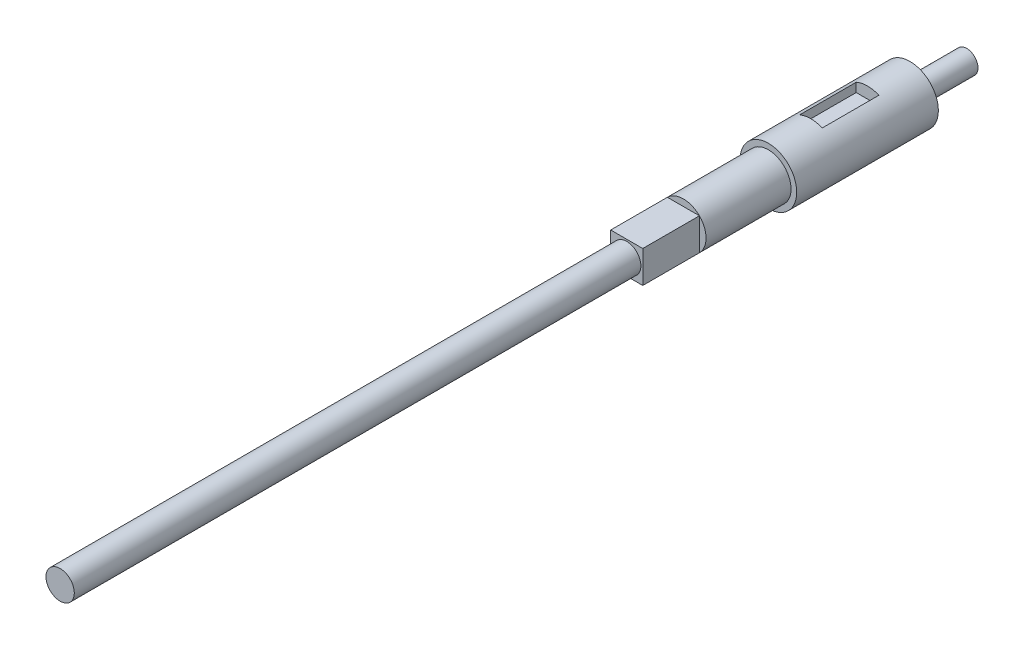
ISO-10303-21;
HEADER;
FILE_DESCRIPTION(('STEP AP214'),'2;1');
FILE_NAME('part.step','',(''),(''),'','','');
FILE_SCHEMA(('AUTOMOTIVE_DESIGN { 1 0 10303 214 1 1 1 1 }'));
ENDSEC;
DATA;
#1=APPLICATION_CONTEXT('core data for automotive mechanical design processes');
#2=APPLICATION_PROTOCOL_DEFINITION('international standard','automotive_design',2000,#1);
#3=PRODUCT_CONTEXT('',#1,'mechanical');
#4=PRODUCT('Part','Part','',(#3));
#5=PRODUCT_RELATED_PRODUCT_CATEGORY('part','',(#4));
#6=PRODUCT_DEFINITION_FORMATION('','',#4);
#7=PRODUCT_DEFINITION_CONTEXT('part definition',#1,'design');
#8=PRODUCT_DEFINITION('design','',#6,#7);
#9=PRODUCT_DEFINITION_SHAPE('','',#8);
#10=(LENGTH_UNIT() NAMED_UNIT(*) SI_UNIT(.MILLI.,.METRE.));
#11=(NAMED_UNIT(*) PLANE_ANGLE_UNIT() SI_UNIT($,.RADIAN.));
#12=(NAMED_UNIT(*) SI_UNIT($,.STERADIAN.) SOLID_ANGLE_UNIT());
#13=UNCERTAINTY_MEASURE_WITH_UNIT(LENGTH_MEASURE(1.E-05),#10,'distance_accuracy_value','');
#14=(GEOMETRIC_REPRESENTATION_CONTEXT(3) GLOBAL_UNCERTAINTY_ASSIGNED_CONTEXT((#13)) GLOBAL_UNIT_ASSIGNED_CONTEXT((#10,
#11,#12)) REPRESENTATION_CONTEXT('',''));
#15=CARTESIAN_POINT('',(0.,0.,0.));
#16=DIRECTION('',(0.,0.,1.));
#17=DIRECTION('',(1.,0.,0.));
#18=AXIS2_PLACEMENT_3D('',#15,#16,#17);
#19=CARTESIAN_POINT('',(0.,0.,27.5));
#20=DIRECTION('',(0.,0.,1.));
#21=DIRECTION('',(1.,0.,0.));
#22=AXIS2_PLACEMENT_3D('',#19,#20,#21);
#23=PLANE('',#22);
#24=DIRECTION('',(0.,1.,0.));
#25=VECTOR('',#24,1.);
#26=CARTESIAN_POINT('',(2.82842712474619,-2.82842712474619,27.5));
#27=LINE('',#26,#25);
#28=CARTESIAN_POINT('',(2.82842712474619,-2.82842712474619,27.5));
#29=VERTEX_POINT('',#28);
#30=CARTESIAN_POINT('',(2.82842712474619,2.82842712474619,27.5));
#31=VERTEX_POINT('',#30);
#32=EDGE_CURVE('E60',#29,#31,#27,.T.);
#33=ORIENTED_EDGE('',*,*,#32,.F.);
#34=CARTESIAN_POINT('',(0.,0.,27.5));
#35=DIRECTION('',(0.,0.,1.));
#36=DIRECTION('',(1.,0.,0.));
#37=AXIS2_PLACEMENT_3D('',#34,#35,#36);
#38=CIRCLE('',#37,4.);
#39=EDGE_CURVE('E169',#29,#31,#38,.T.);
#40=ORIENTED_EDGE('',*,*,#39,.T.);
#41=EDGE_LOOP('',(#33,#40));
#42=FACE_BOUND('',#41,.T.);
#43=ADVANCED_FACE('F37',(#42),#23,.T.);
#44=DIRECTION('',(1.,0.,0.));
#45=VECTOR('',#44,1.);
#46=CARTESIAN_POINT('',(-2.82842712474619,-2.82842712474619,27.5));
#47=LINE('',#46,#45);
#48=CARTESIAN_POINT('',(-2.82842712474619,-2.82842712474619,27.5));
#49=VERTEX_POINT('',#48);
#50=EDGE_CURVE('E142',#49,#29,#47,.T.);
#51=ORIENTED_EDGE('',*,*,#50,.F.);
#52=EDGE_CURVE('E256',#49,#29,#38,.T.);
#53=ORIENTED_EDGE('',*,*,#52,.T.);
#54=EDGE_LOOP('',(#51,#53));
#55=FACE_BOUND('',#54,.T.);
#56=ADVANCED_FACE('F210',(#55),#23,.T.);
#57=DIRECTION('',(0.,-1.,0.));
#58=VECTOR('',#57,1.);
#59=CARTESIAN_POINT('',(-2.82842712474619,-2.82842712474619,27.5));
#60=LINE('',#59,#58);
#61=CARTESIAN_POINT('',(-2.82842712474619,2.82842712474619,27.5));
#62=VERTEX_POINT('',#61);
#63=EDGE_CURVE('E153',#62,#49,#60,.T.);
#64=ORIENTED_EDGE('',*,*,#63,.F.);
#65=EDGE_CURVE('E173',#62,#49,#38,.T.);
#66=ORIENTED_EDGE('',*,*,#65,.T.);
#67=EDGE_LOOP('',(#64,#66));
#68=FACE_BOUND('',#67,.T.);
#69=ADVANCED_FACE('F216',(#68),#23,.T.);
#70=CARTESIAN_POINT('',(0.,0.,12.5));
#71=DIRECTION('',(0.,0.,-1.));
#72=DIRECTION('',(-1.,0.,0.));
#73=AXIS2_PLACEMENT_3D('',#70,#71,#72);
#74=CYLINDRICAL_SURFACE('',#73,5.);
#75=DIRECTION('',(0.,0.,-1.));
#76=VECTOR('',#75,1.);
#77=CARTESIAN_POINT('',(-2.,4.58257569495584,12.5));
#78=LINE('',#77,#76);
#79=CARTESIAN_POINT('',(-2.,4.58257569495584,5.));
#80=VERTEX_POINT('',#79);
#81=CARTESIAN_POINT('',(-2.,4.58257569495584,-5.));
#82=VERTEX_POINT('',#81);
#83=EDGE_CURVE('E41',#80,#82,#78,.T.);
#84=ORIENTED_EDGE('',*,*,#83,.T.);
#85=CARTESIAN_POINT('',(0.,0.,-5.));
#86=DIRECTION('',(0.,0.,-1.));
#87=DIRECTION('',(-1.,0.,0.));
#88=AXIS2_PLACEMENT_3D('',#85,#86,#87);
#89=CIRCLE('',#88,5.);
#90=CARTESIAN_POINT('',(2.,4.58257569495584,-5.));
#91=VERTEX_POINT('',#90);
#92=EDGE_CURVE('E177',#82,#91,#89,.T.);
#93=ORIENTED_EDGE('',*,*,#92,.T.);
#94=DIRECTION('',(0.,0.,-1.));
#95=VECTOR('',#94,1.);
#96=CARTESIAN_POINT('',(2.,4.58257569495584,12.5));
#97=LINE('',#96,#95);
#98=CARTESIAN_POINT('',(2.,4.58257569495584,5.));
#99=VERTEX_POINT('',#98);
#100=EDGE_CURVE('E109',#91,#99,#97,.F.);
#101=ORIENTED_EDGE('',*,*,#100,.T.);
#102=CARTESIAN_POINT('',(0.,0.,5.));
#103=DIRECTION('',(0.,0.,1.));
#104=DIRECTION('',(1.,0.,0.));
#105=AXIS2_PLACEMENT_3D('',#102,#103,#104);
#106=CIRCLE('',#105,5.);
#107=EDGE_CURVE('E190',#99,#80,#106,.T.);
#108=ORIENTED_EDGE('',*,*,#107,.T.);
#109=EDGE_LOOP('',(#84,#93,#101,#108));
#110=FACE_BOUND('',#109,.T.);
#111=CARTESIAN_POINT('',(0.,0.,12.5));
#112=DIRECTION('',(0.,0.,1.));
#113=DIRECTION('',(1.,0.,0.));
#114=AXIS2_PLACEMENT_3D('',#111,#112,#113);
#115=CIRCLE('',#114,5.);
#116=CARTESIAN_POINT('',(5.,0.,12.5));
#117=VERTEX_POINT('',#116);
#118=EDGE_CURVE('E184',#117,#117,#115,.T.);
#119=ORIENTED_EDGE('',*,*,#118,.F.);
#120=EDGE_LOOP('',(#119));
#121=FACE_BOUND('',#120,.T.);
#122=CARTESIAN_POINT('',(0.,0.,-12.5));
#123=DIRECTION('',(0.,0.,1.));
#124=DIRECTION('',(1.,0.,0.));
#125=AXIS2_PLACEMENT_3D('',#122,#123,#124);
#126=CIRCLE('',#125,5.);
#127=CARTESIAN_POINT('',(5.,0.,-12.5));
#128=VERTEX_POINT('',#127);
#129=EDGE_CURVE('E181',#128,#128,#126,.T.);
#130=ORIENTED_EDGE('',*,*,#129,.T.);
#131=EDGE_LOOP('',(#130));
#132=FACE_BOUND('',#131,.T.);
#133=ADVANCED_FACE('F39',(#110,#121,#132),#74,.T.);
#134=CARTESIAN_POINT('',(0.,0.,12.5));
#135=DIRECTION('',(0.,0.,1.));
#136=DIRECTION('',(1.,0.,0.));
#137=AXIS2_PLACEMENT_3D('',#134,#135,#136);
#138=PLANE('',#137);
#139=CARTESIAN_POINT('',(0.,0.,12.5));
#140=DIRECTION('',(0.,0.,1.));
#141=DIRECTION('',(1.,0.,0.));
#142=AXIS2_PLACEMENT_3D('',#139,#140,#141);
#143=CIRCLE('',#142,4.);
#144=CARTESIAN_POINT('',(4.,0.,12.5));
#145=VERTEX_POINT('',#144);
#146=EDGE_CURVE('E174',#145,#145,#143,.T.);
#147=ORIENTED_EDGE('',*,*,#146,.F.);
#148=EDGE_LOOP('',(#147));
#149=FACE_BOUND('',#148,.T.);
#150=ORIENTED_EDGE('',*,*,#118,.T.);
#151=EDGE_LOOP('',(#150));
#152=FACE_BOUND('',#151,.T.);
#153=ADVANCED_FACE('F237',(#149,#152),#138,.T.);
#154=CARTESIAN_POINT('',(0.,0.,-12.5));
#155=DIRECTION('',(0.,0.,1.));
#156=DIRECTION('',(1.,0.,0.));
#157=AXIS2_PLACEMENT_3D('',#154,#155,#156);
#158=PLANE('',#157);
#159=CARTESIAN_POINT('',(0.,0.,-12.5));
#160=DIRECTION('',(0.,0.,-1.));
#161=DIRECTION('',(-1.,0.,0.));
#162=AXIS2_PLACEMENT_3D('',#159,#160,#161);
#163=CIRCLE('',#162,2.);
#164=CARTESIAN_POINT('',(-2.,0.,-12.5));
#165=VERTEX_POINT('',#164);
#166=EDGE_CURVE('E178',#165,#165,#163,.T.);
#167=ORIENTED_EDGE('',*,*,#166,.F.);
#168=EDGE_LOOP('',(#167));
#169=FACE_BOUND('',#168,.T.);
#170=ORIENTED_EDGE('',*,*,#129,.F.);
#171=EDGE_LOOP('',(#170));
#172=FACE_BOUND('',#171,.T.);
#173=ADVANCED_FACE('F263',(#169,#172),#158,.F.);
#174=CARTESIAN_POINT('',(0.,0.,-22.5));
#175=DIRECTION('',(0.,0.,1.));
#176=DIRECTION('',(1.,0.,0.));
#177=AXIS2_PLACEMENT_3D('',#174,#175,#176);
#178=CYLINDRICAL_SURFACE('',#177,2.);
#179=CARTESIAN_POINT('',(0.,0.,-22.5));
#180=DIRECTION('',(0.,0.,-1.));
#181=DIRECTION('',(-1.,0.,0.));
#182=AXIS2_PLACEMENT_3D('',#179,#180,#181);
#183=CIRCLE('',#182,2.);
#184=CARTESIAN_POINT('',(-2.,0.,-22.5));
#185=VERTEX_POINT('',#184);
#186=EDGE_CURVE('E172',#185,#185,#183,.T.);
#187=ORIENTED_EDGE('',*,*,#186,.F.);
#188=EDGE_LOOP('',(#187));
#189=FACE_BOUND('',#188,.T.);
#190=ORIENTED_EDGE('',*,*,#166,.T.);
#191=EDGE_LOOP('',(#190));
#192=FACE_BOUND('',#191,.T.);
#193=ADVANCED_FACE('F270',(#189,#192),#178,.T.);
#194=CARTESIAN_POINT('',(0.,0.,-22.5));
#195=DIRECTION('',(0.,0.,-1.));
#196=DIRECTION('',(-1.,0.,0.));
#197=AXIS2_PLACEMENT_3D('',#194,#195,#196);
#198=PLANE('',#197);
#199=ORIENTED_EDGE('',*,*,#186,.T.);
#200=EDGE_LOOP('',(#199));
#201=FACE_BOUND('',#200,.T.);
#202=ADVANCED_FACE('F230',(#201),#198,.T.);
#203=CARTESIAN_POINT('',(0.,0.,27.5));
#204=DIRECTION('',(0.,0.,-1.));
#205=DIRECTION('',(-1.,0.,0.));
#206=AXIS2_PLACEMENT_3D('',#203,#204,#205);
#207=CYLINDRICAL_SURFACE('',#206,4.);
#208=EDGE_CURVE('E170',#31,#62,#38,.T.);
#209=ORIENTED_EDGE('',*,*,#208,.F.);
#210=ORIENTED_EDGE('',*,*,#39,.F.);
#211=ORIENTED_EDGE('',*,*,#52,.F.);
#212=ORIENTED_EDGE('',*,*,#65,.F.);
#213=EDGE_LOOP('',(#209,#210,#211,#212));
#214=FACE_BOUND('',#213,.T.);
#215=ORIENTED_EDGE('',*,*,#146,.T.);
#216=EDGE_LOOP('',(#215));
#217=FACE_BOUND('',#216,.T.);
#218=ADVANCED_FACE('F222',(#214,#217),#207,.T.);
#219=DIRECTION('',(-1.,0.,0.));
#220=VECTOR('',#219,1.);
#221=CARTESIAN_POINT('',(-2.82842712474619,2.82842712474619,27.5));
#222=LINE('',#221,#220);
#223=EDGE_CURVE('E150',#31,#62,#222,.T.);
#224=ORIENTED_EDGE('',*,*,#223,.F.);
#225=ORIENTED_EDGE('',*,*,#208,.T.);
#226=EDGE_LOOP('',(#224,#225));
#227=FACE_BOUND('',#226,.T.);
#228=ADVANCED_FACE('F212',(#227),#23,.T.);
#229=CARTESIAN_POINT('',(2.82842712474619,-2.82842712474619,37.5));
#230=DIRECTION('',(-1.,0.,0.));
#231=DIRECTION('',(0.,0.,1.));
#232=AXIS2_PLACEMENT_3D('',#229,#230,#231);
#233=PLANE('',#232);
#234=ORIENTED_EDGE('',*,*,#32,.T.);
#235=DIRECTION('',(0.,0.,-1.));
#236=VECTOR('',#235,1.);
#237=CARTESIAN_POINT('',(2.82842712474619,2.82842712474619,37.5));
#238=LINE('',#237,#236);
#239=CARTESIAN_POINT('',(2.82842712474619,2.82842712474619,37.5));
#240=VERTEX_POINT('',#239);
#241=EDGE_CURVE('E166',#240,#31,#238,.T.);
#242=ORIENTED_EDGE('',*,*,#241,.F.);
#243=DIRECTION('',(0.,1.,0.));
#244=VECTOR('',#243,1.);
#245=CARTESIAN_POINT('',(2.82842712474619,-2.82842712474619,37.5));
#246=LINE('',#245,#244);
#247=CARTESIAN_POINT('',(2.82842712474619,-2.82842712474619,37.5));
#248=VERTEX_POINT('',#247);
#249=EDGE_CURVE('E138',#248,#240,#246,.T.);
#250=ORIENTED_EDGE('',*,*,#249,.F.);
#251=DIRECTION('',(0.,0.,-1.));
#252=VECTOR('',#251,1.);
#253=CARTESIAN_POINT('',(2.82842712474619,-2.82842712474619,37.5));
#254=LINE('',#253,#252);
#255=EDGE_CURVE('E148',#248,#29,#254,.T.);
#256=ORIENTED_EDGE('',*,*,#255,.T.);
#257=EDGE_LOOP('',(#234,#242,#250,#256));
#258=FACE_BOUND('',#257,.T.);
#259=ADVANCED_FACE('F221',(#258),#233,.F.);
#260=CARTESIAN_POINT('',(-2.82842712474619,2.82842712474619,37.5));
#261=DIRECTION('',(0.,-1.,0.));
#262=DIRECTION('',(0.,0.,-1.));
#263=AXIS2_PLACEMENT_3D('',#260,#261,#262);
#264=PLANE('',#263);
#265=ORIENTED_EDGE('',*,*,#223,.T.);
#266=DIRECTION('',(0.,0.,-1.));
#267=VECTOR('',#266,1.);
#268=CARTESIAN_POINT('',(-2.82842712474619,2.82842712474619,37.5));
#269=LINE('',#268,#267);
#270=CARTESIAN_POINT('',(-2.82842712474619,2.82842712474619,37.5));
#271=VERTEX_POINT('',#270);
#272=EDGE_CURVE('E163',#271,#62,#269,.T.);
#273=ORIENTED_EDGE('',*,*,#272,.F.);
#274=DIRECTION('',(-1.,0.,0.));
#275=VECTOR('',#274,1.);
#276=CARTESIAN_POINT('',(-2.82842712474619,2.82842712474619,37.5));
#277=LINE('',#276,#275);
#278=EDGE_CURVE('E141',#240,#271,#277,.T.);
#279=ORIENTED_EDGE('',*,*,#278,.F.);
#280=ORIENTED_EDGE('',*,*,#241,.T.);
#281=EDGE_LOOP('',(#265,#273,#279,#280));
#282=FACE_BOUND('',#281,.T.);
#283=ADVANCED_FACE('F228',(#282),#264,.F.);
#284=CARTESIAN_POINT('',(-2.82842712474619,-2.82842712474619,37.5));
#285=DIRECTION('',(1.,0.,0.));
#286=DIRECTION('',(0.,0.,-1.));
#287=AXIS2_PLACEMENT_3D('',#284,#285,#286);
#288=PLANE('',#287);
#289=ORIENTED_EDGE('',*,*,#63,.T.);
#290=DIRECTION('',(0.,0.,-1.));
#291=VECTOR('',#290,1.);
#292=CARTESIAN_POINT('',(-2.82842712474619,-2.82842712474619,37.5));
#293=LINE('',#292,#291);
#294=CARTESIAN_POINT('',(-2.82842712474619,-2.82842712474619,37.5));
#295=VERTEX_POINT('',#294);
#296=EDGE_CURVE('E160',#295,#49,#293,.T.);
#297=ORIENTED_EDGE('',*,*,#296,.F.);
#298=DIRECTION('',(0.,-1.,0.));
#299=VECTOR('',#298,1.);
#300=CARTESIAN_POINT('',(-2.82842712474619,-2.82842712474619,37.5));
#301=LINE('',#300,#299);
#302=EDGE_CURVE('E144',#271,#295,#301,.T.);
#303=ORIENTED_EDGE('',*,*,#302,.F.);
#304=ORIENTED_EDGE('',*,*,#272,.T.);
#305=EDGE_LOOP('',(#289,#297,#303,#304));
#306=FACE_BOUND('',#305,.T.);
#307=ADVANCED_FACE('F247',(#306),#288,.F.);
#308=CARTESIAN_POINT('',(-2.82842712474619,-2.82842712474619,37.5));
#309=DIRECTION('',(0.,1.,0.));
#310=DIRECTION('',(0.,0.,1.));
#311=AXIS2_PLACEMENT_3D('',#308,#309,#310);
#312=PLANE('',#311);
#313=ORIENTED_EDGE('',*,*,#50,.T.);
#314=ORIENTED_EDGE('',*,*,#255,.F.);
#315=DIRECTION('',(1.,0.,0.));
#316=VECTOR('',#315,1.);
#317=CARTESIAN_POINT('',(-2.82842712474619,-2.82842712474619,37.5));
#318=LINE('',#317,#316);
#319=EDGE_CURVE('E146',#295,#248,#318,.T.);
#320=ORIENTED_EDGE('',*,*,#319,.F.);
#321=ORIENTED_EDGE('',*,*,#296,.T.);
#322=EDGE_LOOP('',(#313,#314,#320,#321));
#323=FACE_BOUND('',#322,.T.);
#324=ADVANCED_FACE('F253',(#323),#312,.F.);
#325=CARTESIAN_POINT('',(0.,0.,37.5));
#326=DIRECTION('',(0.,0.,-1.));
#327=DIRECTION('',(-1.,0.,0.));
#328=AXIS2_PLACEMENT_3D('',#325,#326,#327);
#329=PLANE('',#328);
#330=CARTESIAN_POINT('',(0.,0.,37.5));
#331=DIRECTION('',(0.,0.,1.));
#332=DIRECTION('',(1.,0.,0.));
#333=AXIS2_PLACEMENT_3D('',#330,#331,#332);
#334=CIRCLE('',#333,2.5);
#335=CARTESIAN_POINT('',(2.5,0.,37.5));
#336=VERTEX_POINT('',#335);
#337=EDGE_CURVE('E11',#336,#336,#334,.T.);
#338=ORIENTED_EDGE('',*,*,#337,.F.);
#339=EDGE_LOOP('',(#338));
#340=FACE_BOUND('',#339,.T.);
#341=ORIENTED_EDGE('',*,*,#249,.T.);
#342=ORIENTED_EDGE('',*,*,#278,.T.);
#343=ORIENTED_EDGE('',*,*,#302,.T.);
#344=ORIENTED_EDGE('',*,*,#319,.T.);
#345=EDGE_LOOP('',(#341,#342,#343,#344));
#346=FACE_BOUND('',#345,.T.);
#347=ADVANCED_FACE('F206',(#340,#346),#329,.F.);
#348=CARTESIAN_POINT('',(2.,3.,5.));
#349=DIRECTION('',(1.,0.,0.));
#350=DIRECTION('',(0.,0.,-1.));
#351=AXIS2_PLACEMENT_3D('',#348,#349,#350);
#352=PLANE('',#351);
#353=DIRECTION('',(0.,1.,0.));
#354=VECTOR('',#353,1.);
#355=CARTESIAN_POINT('',(2.,3.,-5.));
#356=LINE('',#355,#354);
#357=CARTESIAN_POINT('',(2.,3.,-5.));
#358=VERTEX_POINT('',#357);
#359=EDGE_CURVE('E53',#358,#91,#356,.T.);
#360=ORIENTED_EDGE('',*,*,#359,.F.);
#361=DIRECTION('',(0.,0.,-1.));
#362=VECTOR('',#361,1.);
#363=CARTESIAN_POINT('',(2.,3.,5.));
#364=LINE('',#363,#362);
#365=CARTESIAN_POINT('',(2.,3.,5.));
#366=VERTEX_POINT('',#365);
#367=EDGE_CURVE('E106',#366,#358,#364,.T.);
#368=ORIENTED_EDGE('',*,*,#367,.F.);
#369=DIRECTION('',(0.,1.,0.));
#370=VECTOR('',#369,1.);
#371=CARTESIAN_POINT('',(2.,3.,5.));
#372=LINE('',#371,#370);
#373=EDGE_CURVE('E132',#366,#99,#372,.T.);
#374=ORIENTED_EDGE('',*,*,#373,.T.);
#375=ORIENTED_EDGE('',*,*,#100,.F.);
#376=EDGE_LOOP('',(#360,#368,#374,#375));
#377=FACE_BOUND('',#376,.T.);
#378=ADVANCED_FACE('F103',(#377),#352,.F.);
#379=CARTESIAN_POINT('',(-2.,3.,5.));
#380=DIRECTION('',(0.,0.,1.));
#381=DIRECTION('',(1.,0.,0.));
#382=AXIS2_PLACEMENT_3D('',#379,#380,#381);
#383=PLANE('',#382);
#384=ORIENTED_EDGE('',*,*,#373,.F.);
#385=DIRECTION('',(1.,0.,0.));
#386=VECTOR('',#385,1.);
#387=CARTESIAN_POINT('',(-2.,3.,5.));
#388=LINE('',#387,#386);
#389=CARTESIAN_POINT('',(-2.,3.,5.));
#390=VERTEX_POINT('',#389);
#391=EDGE_CURVE('E112',#390,#366,#388,.T.);
#392=ORIENTED_EDGE('',*,*,#391,.F.);
#393=DIRECTION('',(0.,1.,0.));
#394=VECTOR('',#393,1.);
#395=CARTESIAN_POINT('',(-2.,3.,5.));
#396=LINE('',#395,#394);
#397=EDGE_CURVE('E134',#390,#80,#396,.T.);
#398=ORIENTED_EDGE('',*,*,#397,.T.);
#399=ORIENTED_EDGE('',*,*,#107,.F.);
#400=EDGE_LOOP('',(#384,#392,#398,#399));
#401=FACE_BOUND('',#400,.T.);
#402=ADVANCED_FACE('F198',(#401),#383,.F.);
#403=CARTESIAN_POINT('',(-2.,3.,5.));
#404=DIRECTION('',(-1.,0.,0.));
#405=DIRECTION('',(0.,0.,1.));
#406=AXIS2_PLACEMENT_3D('',#403,#404,#405);
#407=PLANE('',#406);
#408=ORIENTED_EDGE('',*,*,#397,.F.);
#409=DIRECTION('',(0.,0.,1.));
#410=VECTOR('',#409,1.);
#411=CARTESIAN_POINT('',(-2.,3.,5.));
#412=LINE('',#411,#410);
#413=CARTESIAN_POINT('',(-2.,3.,-5.));
#414=VERTEX_POINT('',#413);
#415=EDGE_CURVE('E121',#414,#390,#412,.T.);
#416=ORIENTED_EDGE('',*,*,#415,.F.);
#417=DIRECTION('',(0.,1.,0.));
#418=VECTOR('',#417,1.);
#419=CARTESIAN_POINT('',(-2.,3.,-5.));
#420=LINE('',#419,#418);
#421=EDGE_CURVE('E111',#414,#82,#420,.T.);
#422=ORIENTED_EDGE('',*,*,#421,.T.);
#423=ORIENTED_EDGE('',*,*,#83,.F.);
#424=EDGE_LOOP('',(#408,#416,#422,#423));
#425=FACE_BOUND('',#424,.T.);
#426=ADVANCED_FACE('F196',(#425),#407,.F.);
#427=CARTESIAN_POINT('',(-2.,3.,-5.));
#428=DIRECTION('',(0.,0.,-1.));
#429=DIRECTION('',(-1.,0.,0.));
#430=AXIS2_PLACEMENT_3D('',#427,#428,#429);
#431=PLANE('',#430);
#432=ORIENTED_EDGE('',*,*,#421,.F.);
#433=DIRECTION('',(-1.,0.,0.));
#434=VECTOR('',#433,1.);
#435=CARTESIAN_POINT('',(-2.,3.,-5.));
#436=LINE('',#435,#434);
#437=EDGE_CURVE('E115',#358,#414,#436,.T.);
#438=ORIENTED_EDGE('',*,*,#437,.F.);
#439=ORIENTED_EDGE('',*,*,#359,.T.);
#440=ORIENTED_EDGE('',*,*,#92,.F.);
#441=EDGE_LOOP('',(#432,#438,#439,#440));
#442=FACE_BOUND('',#441,.T.);
#443=ADVANCED_FACE('F116',(#442),#431,.F.);
#444=CARTESIAN_POINT('',(0.,3.,0.));
#445=DIRECTION('',(0.,-1.,0.));
#446=DIRECTION('',(0.,0.,-1.));
#447=AXIS2_PLACEMENT_3D('',#444,#445,#446);
#448=PLANE('',#447);
#449=ORIENTED_EDGE('',*,*,#367,.T.);
#450=ORIENTED_EDGE('',*,*,#437,.T.);
#451=ORIENTED_EDGE('',*,*,#415,.T.);
#452=ORIENTED_EDGE('',*,*,#391,.T.);
#453=EDGE_LOOP('',(#449,#450,#451,#452));
#454=FACE_BOUND('',#453,.T.);
#455=ADVANCED_FACE('F123',(#454),#448,.F.);
#456=CARTESIAN_POINT('',(0.,0.,137.5));
#457=DIRECTION('',(0.,0.,-1.));
#458=DIRECTION('',(-1.,0.,0.));
#459=AXIS2_PLACEMENT_3D('',#456,#457,#458);
#460=CYLINDRICAL_SURFACE('',#459,2.5);
#461=CARTESIAN_POINT('',(0.,0.,137.5));
#462=DIRECTION('',(0.,0.,1.));
#463=DIRECTION('',(1.,0.,0.));
#464=AXIS2_PLACEMENT_3D('',#461,#462,#463);
#465=CIRCLE('',#464,2.5);
#466=CARTESIAN_POINT('',(2.5,0.,137.5));
#467=VERTEX_POINT('',#466);
#468=EDGE_CURVE('E125',#467,#467,#465,.T.);
#469=ORIENTED_EDGE('',*,*,#468,.F.);
#470=EDGE_LOOP('',(#469));
#471=FACE_BOUND('',#470,.T.);
#472=ORIENTED_EDGE('',*,*,#337,.T.);
#473=EDGE_LOOP('',(#472));
#474=FACE_BOUND('',#473,.T.);
#475=ADVANCED_FACE('F302',(#471,#474),#460,.T.);
#476=CARTESIAN_POINT('',(0.,0.,137.5));
#477=DIRECTION('',(0.,0.,1.));
#478=DIRECTION('',(1.,0.,0.));
#479=AXIS2_PLACEMENT_3D('',#476,#477,#478);
#480=PLANE('',#479);
#481=ORIENTED_EDGE('',*,*,#468,.T.);
#482=EDGE_LOOP('',(#481));
#483=FACE_BOUND('',#482,.T.);
#484=ADVANCED_FACE('F306',(#483),#480,.T.);
#485=CLOSED_SHELL('',(#43,#56,#69,#133,#153,#173,#193,#202,#218,#228,#259,#283,#307,#324,#347,
#378,#402,#426,#443,#455,#475,#484));
#486=MANIFOLD_SOLID_BREP('B2',#485);
#487=ADVANCED_BREP_SHAPE_REPRESENTATION('',(#18,#486),#14);
#488=SHAPE_DEFINITION_REPRESENTATION(#9,#487);
ENDSEC;
END-ISO-10303-21;
